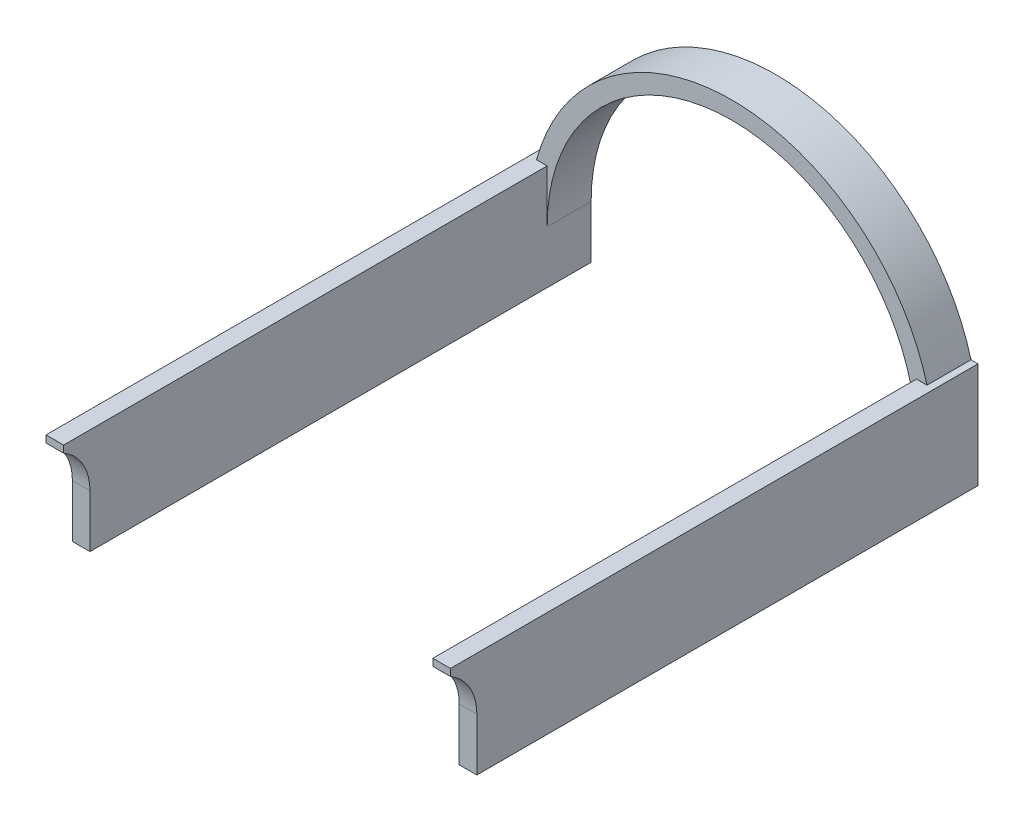
ISO-10303-21;
HEADER;
FILE_DESCRIPTION(('STEP AP214'),'2;1');
FILE_NAME('part.step','',(''),(''),'','','');
FILE_SCHEMA(('AUTOMOTIVE_DESIGN { 1 0 10303 214 1 1 1 1 }'));
ENDSEC;
DATA;
#1=APPLICATION_CONTEXT('core data for automotive mechanical design processes');
#2=APPLICATION_PROTOCOL_DEFINITION('international standard','automotive_design',2000,#1);
#3=PRODUCT_CONTEXT('',#1,'mechanical');
#4=PRODUCT('Part','Part','',(#3));
#5=PRODUCT_RELATED_PRODUCT_CATEGORY('part','',(#4));
#6=PRODUCT_DEFINITION_FORMATION('','',#4);
#7=PRODUCT_DEFINITION_CONTEXT('part definition',#1,'design');
#8=PRODUCT_DEFINITION('design','',#6,#7);
#9=PRODUCT_DEFINITION_SHAPE('','',#8);
#10=(LENGTH_UNIT() NAMED_UNIT(*) SI_UNIT(.MILLI.,.METRE.));
#11=(NAMED_UNIT(*) PLANE_ANGLE_UNIT() SI_UNIT($,.RADIAN.));
#12=(NAMED_UNIT(*) SI_UNIT($,.STERADIAN.) SOLID_ANGLE_UNIT());
#13=UNCERTAINTY_MEASURE_WITH_UNIT(LENGTH_MEASURE(1.E-05),#10,'distance_accuracy_value','');
#14=(GEOMETRIC_REPRESENTATION_CONTEXT(3) GLOBAL_UNCERTAINTY_ASSIGNED_CONTEXT((#13)) GLOBAL_UNIT_ASSIGNED_CONTEXT((#10,
#11,#12)) REPRESENTATION_CONTEXT('',''));
#15=CARTESIAN_POINT('',(0.,0.,0.));
#16=DIRECTION('',(0.,0.,1.));
#17=DIRECTION('',(1.,0.,0.));
#18=AXIS2_PLACEMENT_3D('',#15,#16,#17);
#19=CARTESIAN_POINT('',(0.,0.,10.));
#20=DIRECTION('',(0.,0.,-1.));
#21=DIRECTION('',(-1.,0.,0.));
#22=AXIS2_PLACEMENT_3D('',#19,#20,#21);
#23=CYLINDRICAL_SURFACE('',#22,46.);
#24=CARTESIAN_POINT('',(0.,0.,0.));
#25=DIRECTION('',(0.,0.,1.));
#26=DIRECTION('',(-1.,0.,0.));
#27=AXIS2_PLACEMENT_3D('',#24,#25,#26);
#28=CIRCLE('',#27,46.);
#29=CARTESIAN_POINT('',(44.407206622349,12.,0.));
#30=VERTEX_POINT('',#29);
#31=CARTESIAN_POINT('',(-44.407206622349,12.,0.));
#32=VERTEX_POINT('',#31);
#33=EDGE_CURVE('E296',#30,#32,#28,.T.);
#34=ORIENTED_EDGE('',*,*,#33,.T.);
#35=DIRECTION('',(0.,0.,-1.));
#36=VECTOR('',#35,1.);
#37=CARTESIAN_POINT('',(-44.407206622349,12.,10.));
#38=LINE('',#37,#36);
#39=CARTESIAN_POINT('',(-44.407206622349,12.,10.));
#40=VERTEX_POINT('',#39);
#41=EDGE_CURVE('E237',#32,#40,#38,.F.);
#42=ORIENTED_EDGE('',*,*,#41,.T.);
#43=CARTESIAN_POINT('',(0.,0.,10.));
#44=DIRECTION('',(0.,0.,1.));
#45=DIRECTION('',(-1.,0.,0.));
#46=AXIS2_PLACEMENT_3D('',#43,#44,#45);
#47=CIRCLE('',#46,46.);
#48=CARTESIAN_POINT('',(44.407206622349,12.,10.));
#49=VERTEX_POINT('',#48);
#50=EDGE_CURVE('E297',#49,#40,#47,.T.);
#51=ORIENTED_EDGE('',*,*,#50,.F.);
#52=DIRECTION('',(0.,0.,-1.));
#53=VECTOR('',#52,1.);
#54=CARTESIAN_POINT('',(44.407206622349,12.,10.));
#55=LINE('',#54,#53);
#56=EDGE_CURVE('E292',#49,#30,#55,.T.);
#57=ORIENTED_EDGE('',*,*,#56,.T.);
#58=EDGE_LOOP('',(#34,#42,#51,#57));
#59=FACE_BOUND('',#58,.T.);
#60=ADVANCED_FACE('F39',(#59),#23,.T.);
#61=CARTESIAN_POINT('',(0.,0.,10.));
#62=DIRECTION('',(0.,0.,-1.));
#63=DIRECTION('',(-1.,0.,0.));
#64=AXIS2_PLACEMENT_3D('',#61,#62,#63);
#65=CYLINDRICAL_SURFACE('',#64,42.);
#66=CARTESIAN_POINT('',(0.,0.,0.));
#67=DIRECTION('',(0.,0.,-1.));
#68=DIRECTION('',(-1.,0.,0.));
#69=AXIS2_PLACEMENT_3D('',#66,#67,#68);
#70=CIRCLE('',#69,42.);
#71=CARTESIAN_POINT('',(-42.,0.,0.));
#72=VERTEX_POINT('',#71);
#73=CARTESIAN_POINT('',(42.,0.,0.));
#74=VERTEX_POINT('',#73);
#75=EDGE_CURVE('E302',#72,#74,#70,.T.);
#76=ORIENTED_EDGE('',*,*,#75,.T.);
#77=DIRECTION('',(0.,0.,-1.));
#78=VECTOR('',#77,1.);
#79=CARTESIAN_POINT('',(42.,0.,10.));
#80=LINE('',#79,#78);
#81=CARTESIAN_POINT('',(42.,0.,10.));
#82=VERTEX_POINT('',#81);
#83=EDGE_CURVE('E306',#82,#74,#80,.T.);
#84=ORIENTED_EDGE('',*,*,#83,.F.);
#85=CARTESIAN_POINT('',(0.,0.,10.));
#86=DIRECTION('',(0.,0.,-1.));
#87=DIRECTION('',(-1.,0.,0.));
#88=AXIS2_PLACEMENT_3D('',#85,#86,#87);
#89=CIRCLE('',#88,42.);
#90=CARTESIAN_POINT('',(-42.,0.,10.));
#91=VERTEX_POINT('',#90);
#92=EDGE_CURVE('E301',#91,#82,#89,.T.);
#93=ORIENTED_EDGE('',*,*,#92,.F.);
#94=DIRECTION('',(0.,0.,-1.));
#95=VECTOR('',#94,1.);
#96=CARTESIAN_POINT('',(-42.,0.,10.));
#97=LINE('',#96,#95);
#98=EDGE_CURVE('E315',#91,#72,#97,.T.);
#99=ORIENTED_EDGE('',*,*,#98,.T.);
#100=EDGE_LOOP('',(#76,#84,#93,#99));
#101=FACE_BOUND('',#100,.T.);
#102=ADVANCED_FACE('F354',(#101),#65,.F.);
#103=CARTESIAN_POINT('',(0.,0.,10.));
#104=DIRECTION('',(0.,0.,-1.));
#105=DIRECTION('',(-1.,0.,0.));
#106=AXIS2_PLACEMENT_3D('',#103,#104,#105);
#107=PLANE('',#106);
#108=DIRECTION('',(1.,0.,0.));
#109=VECTOR('',#108,1.);
#110=CARTESIAN_POINT('',(0.,12.,10.));
#111=LINE('',#110,#109);
#112=CARTESIAN_POINT('',(-42.,12.,10.));
#113=VERTEX_POINT('',#112);
#114=EDGE_CURVE('E224',#40,#113,#111,.T.);
#115=ORIENTED_EDGE('',*,*,#114,.T.);
#116=DIRECTION('',(0.,-1.,0.));
#117=VECTOR('',#116,1.);
#118=CARTESIAN_POINT('',(-42.,0.,10.));
#119=LINE('',#118,#117);
#120=EDGE_CURVE('E241',#113,#91,#119,.T.);
#121=ORIENTED_EDGE('',*,*,#120,.T.);
#122=ORIENTED_EDGE('',*,*,#92,.T.);
#123=DIRECTION('',(0.,1.,0.));
#124=VECTOR('',#123,1.);
#125=CARTESIAN_POINT('',(42.,0.,10.));
#126=LINE('',#125,#124);
#127=CARTESIAN_POINT('',(42.,12.,10.));
#128=VERTEX_POINT('',#127);
#129=EDGE_CURVE('E276',#82,#128,#126,.T.);
#130=ORIENTED_EDGE('',*,*,#129,.T.);
#131=DIRECTION('',(1.,0.,0.));
#132=VECTOR('',#131,1.);
#133=CARTESIAN_POINT('',(0.,12.,10.));
#134=LINE('',#133,#132);
#135=EDGE_CURVE('E288',#128,#49,#134,.T.);
#136=ORIENTED_EDGE('',*,*,#135,.T.);
#137=ORIENTED_EDGE('',*,*,#50,.T.);
#138=EDGE_LOOP('',(#115,#121,#122,#130,#136,#137));
#139=FACE_BOUND('',#138,.T.);
#140=ADVANCED_FACE('F351',(#139),#107,.F.);
#141=CARTESIAN_POINT('',(0.,0.,0.));
#142=DIRECTION('',(0.,0.,-1.));
#143=DIRECTION('',(-1.,0.,0.));
#144=AXIS2_PLACEMENT_3D('',#141,#142,#143);
#145=PLANE('',#144);
#146=ORIENTED_EDGE('',*,*,#75,.F.);
#147=DIRECTION('',(0.,-1.,0.));
#148=VECTOR('',#147,1.);
#149=CARTESIAN_POINT('',(-42.,12.,0.));
#150=LINE('',#149,#148);
#151=CARTESIAN_POINT('',(-42.,-12.,0.));
#152=VERTEX_POINT('',#151);
#153=EDGE_CURVE('E215',#72,#152,#150,.T.);
#154=ORIENTED_EDGE('',*,*,#153,.T.);
#155=DIRECTION('',(-1.,0.,0.));
#156=VECTOR('',#155,1.);
#157=CARTESIAN_POINT('',(-46.,-12.,0.));
#158=LINE('',#157,#156);
#159=CARTESIAN_POINT('',(-46.,-12.,0.));
#160=VERTEX_POINT('',#159);
#161=EDGE_CURVE('E200',#152,#160,#158,.T.);
#162=ORIENTED_EDGE('',*,*,#161,.T.);
#163=DIRECTION('',(0.,1.,0.));
#164=VECTOR('',#163,1.);
#165=CARTESIAN_POINT('',(-46.,12.,0.));
#166=LINE('',#165,#164);
#167=CARTESIAN_POINT('',(-46.,12.,0.));
#168=VERTEX_POINT('',#167);
#169=EDGE_CURVE('E195',#160,#168,#166,.T.);
#170=ORIENTED_EDGE('',*,*,#169,.T.);
#171=DIRECTION('',(1.,0.,0.));
#172=VECTOR('',#171,1.);
#173=CARTESIAN_POINT('',(-46.,12.,0.));
#174=LINE('',#173,#172);
#175=EDGE_CURVE('E211',#168,#32,#174,.T.);
#176=ORIENTED_EDGE('',*,*,#175,.T.);
#177=ORIENTED_EDGE('',*,*,#33,.F.);
#178=DIRECTION('',(1.,0.,0.));
#179=VECTOR('',#178,1.);
#180=CARTESIAN_POINT('',(46.,12.,0.));
#181=LINE('',#180,#179);
#182=CARTESIAN_POINT('',(46.,12.,0.));
#183=VERTEX_POINT('',#182);
#184=EDGE_CURVE('E251',#30,#183,#181,.T.);
#185=ORIENTED_EDGE('',*,*,#184,.T.);
#186=DIRECTION('',(0.,-1.,0.));
#187=VECTOR('',#186,1.);
#188=CARTESIAN_POINT('',(46.,12.,0.));
#189=LINE('',#188,#187);
#190=CARTESIAN_POINT('',(46.,-12.,0.));
#191=VERTEX_POINT('',#190);
#192=EDGE_CURVE('E245',#183,#191,#189,.T.);
#193=ORIENTED_EDGE('',*,*,#192,.T.);
#194=DIRECTION('',(-1.,0.,0.));
#195=VECTOR('',#194,1.);
#196=CARTESIAN_POINT('',(46.,-12.,0.));
#197=LINE('',#196,#195);
#198=CARTESIAN_POINT('',(42.,-12.,0.));
#199=VERTEX_POINT('',#198);
#200=EDGE_CURVE('E262',#191,#199,#197,.T.);
#201=ORIENTED_EDGE('',*,*,#200,.T.);
#202=DIRECTION('',(0.,1.,0.));
#203=VECTOR('',#202,1.);
#204=CARTESIAN_POINT('',(42.,12.,0.));
#205=LINE('',#204,#203);
#206=EDGE_CURVE('E266',#199,#74,#205,.T.);
#207=ORIENTED_EDGE('',*,*,#206,.T.);
#208=EDGE_LOOP('',(#146,#154,#162,#170,#176,#177,#185,#193,#201,#207));
#209=FACE_BOUND('',#208,.T.);
#210=ADVANCED_FACE('F357',(#209),#145,.T.);
#211=CARTESIAN_POINT('',(46.,12.,120.));
#212=DIRECTION('',(0.,1.,0.));
#213=DIRECTION('',(0.,0.,1.));
#214=AXIS2_PLACEMENT_3D('',#211,#212,#213);
#215=PLANE('',#214);
#216=ORIENTED_EDGE('',*,*,#56,.F.);
#217=ORIENTED_EDGE('',*,*,#135,.F.);
#218=DIRECTION('',(0.,0.,-1.));
#219=VECTOR('',#218,1.);
#220=CARTESIAN_POINT('',(42.,12.,120.));
#221=LINE('',#220,#219);
#222=CARTESIAN_POINT('',(42.,12.,120.));
#223=VERTEX_POINT('',#222);
#224=EDGE_CURVE('E277',#223,#128,#221,.T.);
#225=ORIENTED_EDGE('',*,*,#224,.F.);
#226=DIRECTION('',(1.,0.,0.));
#227=VECTOR('',#226,1.);
#228=CARTESIAN_POINT('',(46.,12.,120.));
#229=LINE('',#228,#227);
#230=CARTESIAN_POINT('',(46.,12.,120.));
#231=VERTEX_POINT('',#230);
#232=EDGE_CURVE('E254',#223,#231,#229,.T.);
#233=ORIENTED_EDGE('',*,*,#232,.T.);
#234=DIRECTION('',(0.,0.,-1.));
#235=VECTOR('',#234,1.);
#236=CARTESIAN_POINT('',(46.,12.,120.));
#237=LINE('',#236,#235);
#238=EDGE_CURVE('E272',#231,#183,#237,.T.);
#239=ORIENTED_EDGE('',*,*,#238,.T.);
#240=ORIENTED_EDGE('',*,*,#184,.F.);
#241=EDGE_LOOP('',(#216,#217,#225,#233,#239,#240));
#242=FACE_BOUND('',#241,.T.);
#243=ADVANCED_FACE('F346',(#242),#215,.T.);
#244=CARTESIAN_POINT('',(42.,12.,120.));
#245=DIRECTION('',(-1.,0.,0.));
#246=DIRECTION('',(0.,0.,1.));
#247=AXIS2_PLACEMENT_3D('',#244,#245,#246);
#248=PLANE('',#247);
#249=CARTESIAN_POINT('',(42.,0.,126.));
#250=DIRECTION('',(-1.,0.,0.));
#251=DIRECTION('',(0.,0.,1.));
#252=AXIS2_PLACEMENT_3D('',#249,#250,#251);
#253=CIRCLE('',#252,12.);
#254=CARTESIAN_POINT('',(42.,10.3923048454133,120.));
#255=VERTEX_POINT('',#254);
#256=CARTESIAN_POINT('',(42.,0.,114.));
#257=VERTEX_POINT('',#256);
#258=EDGE_CURVE('E186',#255,#257,#253,.T.);
#259=ORIENTED_EDGE('',*,*,#258,.F.);
#260=DIRECTION('',(0.,1.,0.));
#261=VECTOR('',#260,1.);
#262=CARTESIAN_POINT('',(42.,12.,120.));
#263=LINE('',#262,#261);
#264=EDGE_CURVE('E250',#255,#223,#263,.T.);
#265=ORIENTED_EDGE('',*,*,#264,.T.);
#266=ORIENTED_EDGE('',*,*,#224,.T.);
#267=ORIENTED_EDGE('',*,*,#129,.F.);
#268=ORIENTED_EDGE('',*,*,#83,.T.);
#269=ORIENTED_EDGE('',*,*,#206,.F.);
#270=DIRECTION('',(0.,0.,-1.));
#271=VECTOR('',#270,1.);
#272=CARTESIAN_POINT('',(42.,-12.,120.));
#273=LINE('',#272,#271);
#274=CARTESIAN_POINT('',(42.,-12.,114.));
#275=VERTEX_POINT('',#274);
#276=EDGE_CURVE('E280',#275,#199,#273,.T.);
#277=ORIENTED_EDGE('',*,*,#276,.F.);
#278=DIRECTION('',(0.,-1.,0.));
#279=VECTOR('',#278,1.);
#280=CARTESIAN_POINT('',(42.,12.,114.));
#281=LINE('',#280,#279);
#282=EDGE_CURVE('E192',#257,#275,#281,.T.);
#283=ORIENTED_EDGE('',*,*,#282,.F.);
#284=EDGE_LOOP('',(#259,#265,#266,#267,#268,#269,#277,#283));
#285=FACE_BOUND('',#284,.T.);
#286=ADVANCED_FACE('F330',(#285),#248,.T.);
#287=CARTESIAN_POINT('',(46.,12.,120.));
#288=DIRECTION('',(1.,0.,0.));
#289=DIRECTION('',(0.,1.,0.));
#290=AXIS2_PLACEMENT_3D('',#287,#288,#289);
#291=PLANE('',#290);
#292=CARTESIAN_POINT('',(46.,0.,126.));
#293=DIRECTION('',(1.,0.,0.));
#294=DIRECTION('',(0.,1.,0.));
#295=AXIS2_PLACEMENT_3D('',#292,#293,#294);
#296=CIRCLE('',#295,12.);
#297=CARTESIAN_POINT('',(46.,0.,114.));
#298=VERTEX_POINT('',#297);
#299=CARTESIAN_POINT('',(46.,10.3923048454133,120.));
#300=VERTEX_POINT('',#299);
#301=EDGE_CURVE('E54',#298,#300,#296,.T.);
#302=ORIENTED_EDGE('',*,*,#301,.F.);
#303=DIRECTION('',(0.,1.,0.));
#304=VECTOR('',#303,1.);
#305=CARTESIAN_POINT('',(46.,12.,114.));
#306=LINE('',#305,#304);
#307=CARTESIAN_POINT('',(46.,-12.,114.));
#308=VERTEX_POINT('',#307);
#309=EDGE_CURVE('E189',#308,#298,#306,.T.);
#310=ORIENTED_EDGE('',*,*,#309,.F.);
#311=DIRECTION('',(0.,0.,-1.));
#312=VECTOR('',#311,1.);
#313=CARTESIAN_POINT('',(46.,-12.,120.));
#314=LINE('',#313,#312);
#315=EDGE_CURVE('E258',#308,#191,#314,.T.);
#316=ORIENTED_EDGE('',*,*,#315,.T.);
#317=ORIENTED_EDGE('',*,*,#192,.F.);
#318=ORIENTED_EDGE('',*,*,#238,.F.);
#319=DIRECTION('',(0.,-1.,0.));
#320=VECTOR('',#319,1.);
#321=CARTESIAN_POINT('',(46.,12.,120.));
#322=LINE('',#321,#320);
#323=EDGE_CURVE('E246',#231,#300,#322,.T.);
#324=ORIENTED_EDGE('',*,*,#323,.T.);
#325=EDGE_LOOP('',(#302,#310,#316,#317,#318,#324));
#326=FACE_BOUND('',#325,.T.);
#327=ADVANCED_FACE('F338',(#326),#291,.T.);
#328=CARTESIAN_POINT('',(46.,-12.,120.));
#329=DIRECTION('',(0.,-1.,0.));
#330=DIRECTION('',(0.,0.,-1.));
#331=AXIS2_PLACEMENT_3D('',#328,#329,#330);
#332=PLANE('',#331);
#333=DIRECTION('',(-1.,0.,0.));
#334=VECTOR('',#333,1.);
#335=CARTESIAN_POINT('',(74.,-12.,114.));
#336=LINE('',#335,#334);
#337=EDGE_CURVE('E177',#308,#275,#336,.T.);
#338=ORIENTED_EDGE('',*,*,#337,.T.);
#339=ORIENTED_EDGE('',*,*,#276,.T.);
#340=ORIENTED_EDGE('',*,*,#200,.F.);
#341=ORIENTED_EDGE('',*,*,#315,.F.);
#342=EDGE_LOOP('',(#338,#339,#340,#341));
#343=FACE_BOUND('',#342,.T.);
#344=ADVANCED_FACE('F335',(#343),#332,.T.);
#345=CARTESIAN_POINT('',(0.,0.,120.));
#346=DIRECTION('',(0.,0.,-1.));
#347=DIRECTION('',(-1.,0.,0.));
#348=AXIS2_PLACEMENT_3D('',#345,#346,#347);
#349=PLANE('',#348);
#350=ORIENTED_EDGE('',*,*,#264,.F.);
#351=DIRECTION('',(-1.,0.,0.));
#352=VECTOR('',#351,1.);
#353=CARTESIAN_POINT('',(74.,10.3923048454133,120.));
#354=LINE('',#353,#352);
#355=EDGE_CURVE('E181',#255,#300,#354,.F.);
#356=ORIENTED_EDGE('',*,*,#355,.T.);
#357=ORIENTED_EDGE('',*,*,#323,.F.);
#358=ORIENTED_EDGE('',*,*,#232,.F.);
#359=EDGE_LOOP('',(#350,#356,#357,#358));
#360=FACE_BOUND('',#359,.T.);
#361=ADVANCED_FACE('F343',(#360),#349,.F.);
#362=CARTESIAN_POINT('',(-46.,12.,120.));
#363=DIRECTION('',(0.,1.,0.));
#364=DIRECTION('',(0.,0.,1.));
#365=AXIS2_PLACEMENT_3D('',#362,#363,#364);
#366=PLANE('',#365);
#367=ORIENTED_EDGE('',*,*,#41,.F.);
#368=ORIENTED_EDGE('',*,*,#175,.F.);
#369=DIRECTION('',(0.,0.,-1.));
#370=VECTOR('',#369,1.);
#371=CARTESIAN_POINT('',(-46.,12.,120.));
#372=LINE('',#371,#370);
#373=CARTESIAN_POINT('',(-46.,12.,120.));
#374=VERTEX_POINT('',#373);
#375=EDGE_CURVE('E208',#374,#168,#372,.T.);
#376=ORIENTED_EDGE('',*,*,#375,.F.);
#377=DIRECTION('',(1.,0.,0.));
#378=VECTOR('',#377,1.);
#379=CARTESIAN_POINT('',(-46.,12.,120.));
#380=LINE('',#379,#378);
#381=CARTESIAN_POINT('',(-42.,12.,120.));
#382=VERTEX_POINT('',#381);
#383=EDGE_CURVE('E199',#374,#382,#380,.T.);
#384=ORIENTED_EDGE('',*,*,#383,.T.);
#385=DIRECTION('',(0.,0.,-1.));
#386=VECTOR('',#385,1.);
#387=CARTESIAN_POINT('',(-42.,12.,120.));
#388=LINE('',#387,#386);
#389=EDGE_CURVE('E228',#382,#113,#388,.T.);
#390=ORIENTED_EDGE('',*,*,#389,.T.);
#391=ORIENTED_EDGE('',*,*,#114,.F.);
#392=EDGE_LOOP('',(#367,#368,#376,#384,#390,#391));
#393=FACE_BOUND('',#392,.T.);
#394=ADVANCED_FACE('F363',(#393),#366,.T.);
#395=CARTESIAN_POINT('',(-46.,12.,120.));
#396=DIRECTION('',(-1.,0.,0.));
#397=DIRECTION('',(0.,0.,1.));
#398=AXIS2_PLACEMENT_3D('',#395,#396,#397);
#399=PLANE('',#398);
#400=CARTESIAN_POINT('',(-46.,0.,126.));
#401=DIRECTION('',(-1.,0.,0.));
#402=DIRECTION('',(0.,0.,1.));
#403=AXIS2_PLACEMENT_3D('',#400,#401,#402);
#404=CIRCLE('',#403,12.);
#405=CARTESIAN_POINT('',(-46.,10.3923048454133,120.));
#406=VERTEX_POINT('',#405);
#407=CARTESIAN_POINT('',(-46.,0.,114.));
#408=VERTEX_POINT('',#407);
#409=EDGE_CURVE('E162',#406,#408,#404,.T.);
#410=ORIENTED_EDGE('',*,*,#409,.F.);
#411=DIRECTION('',(0.,1.,0.));
#412=VECTOR('',#411,1.);
#413=CARTESIAN_POINT('',(-46.,12.,120.));
#414=LINE('',#413,#412);
#415=EDGE_CURVE('E196',#406,#374,#414,.T.);
#416=ORIENTED_EDGE('',*,*,#415,.T.);
#417=ORIENTED_EDGE('',*,*,#375,.T.);
#418=ORIENTED_EDGE('',*,*,#169,.F.);
#419=DIRECTION('',(0.,0.,-1.));
#420=VECTOR('',#419,1.);
#421=CARTESIAN_POINT('',(-46.,-12.,120.));
#422=LINE('',#421,#420);
#423=CARTESIAN_POINT('',(-46.,-12.,114.));
#424=VERTEX_POINT('',#423);
#425=EDGE_CURVE('E171',#424,#160,#422,.T.);
#426=ORIENTED_EDGE('',*,*,#425,.F.);
#427=DIRECTION('',(0.,-1.,0.));
#428=VECTOR('',#427,1.);
#429=CARTESIAN_POINT('',(-46.,0.,114.));
#430=LINE('',#429,#428);
#431=EDGE_CURVE('E155',#408,#424,#430,.T.);
#432=ORIENTED_EDGE('',*,*,#431,.F.);
#433=EDGE_LOOP('',(#410,#416,#417,#418,#426,#432));
#434=FACE_BOUND('',#433,.T.);
#435=ADVANCED_FACE('F169',(#434),#399,.T.);
#436=CARTESIAN_POINT('',(-46.,-12.,120.));
#437=DIRECTION('',(0.,-1.,0.));
#438=DIRECTION('',(0.,0.,-1.));
#439=AXIS2_PLACEMENT_3D('',#436,#437,#438);
#440=PLANE('',#439);
#441=CARTESIAN_POINT('',(-42.,-12.,114.));
#442=VERTEX_POINT('',#441);
#443=EDGE_CURVE('E175',#442,#424,#336,.T.);
#444=ORIENTED_EDGE('',*,*,#443,.T.);
#445=ORIENTED_EDGE('',*,*,#425,.T.);
#446=ORIENTED_EDGE('',*,*,#161,.F.);
#447=DIRECTION('',(0.,0.,-1.));
#448=VECTOR('',#447,1.);
#449=CARTESIAN_POINT('',(-42.,-12.,120.));
#450=LINE('',#449,#448);
#451=EDGE_CURVE('E225',#442,#152,#450,.T.);
#452=ORIENTED_EDGE('',*,*,#451,.F.);
#453=EDGE_LOOP('',(#444,#445,#446,#452));
#454=FACE_BOUND('',#453,.T.);
#455=ADVANCED_FACE('F372',(#454),#440,.T.);
#456=CARTESIAN_POINT('',(-42.,12.,120.));
#457=DIRECTION('',(1.,0.,0.));
#458=DIRECTION('',(0.,1.,0.));
#459=AXIS2_PLACEMENT_3D('',#456,#457,#458);
#460=PLANE('',#459);
#461=CARTESIAN_POINT('',(-42.,0.,126.));
#462=DIRECTION('',(1.,0.,0.));
#463=DIRECTION('',(0.,1.,0.));
#464=AXIS2_PLACEMENT_3D('',#461,#462,#463);
#465=CIRCLE('',#464,12.);
#466=CARTESIAN_POINT('',(-42.,0.,114.));
#467=VERTEX_POINT('',#466);
#468=CARTESIAN_POINT('',(-42.,10.3923048454133,120.));
#469=VERTEX_POINT('',#468);
#470=EDGE_CURVE('E62',#467,#469,#465,.T.);
#471=ORIENTED_EDGE('',*,*,#470,.F.);
#472=DIRECTION('',(0.,1.,0.));
#473=VECTOR('',#472,1.);
#474=CARTESIAN_POINT('',(-42.,12.,114.));
#475=LINE('',#474,#473);
#476=EDGE_CURVE('E11',#442,#467,#475,.T.);
#477=ORIENTED_EDGE('',*,*,#476,.F.);
#478=ORIENTED_EDGE('',*,*,#451,.T.);
#479=ORIENTED_EDGE('',*,*,#153,.F.);
#480=ORIENTED_EDGE('',*,*,#98,.F.);
#481=ORIENTED_EDGE('',*,*,#120,.F.);
#482=ORIENTED_EDGE('',*,*,#389,.F.);
#483=DIRECTION('',(0.,-1.,0.));
#484=VECTOR('',#483,1.);
#485=CARTESIAN_POINT('',(-42.,12.,120.));
#486=LINE('',#485,#484);
#487=EDGE_CURVE('E204',#382,#469,#486,.T.);
#488=ORIENTED_EDGE('',*,*,#487,.T.);
#489=EDGE_LOOP('',(#471,#477,#478,#479,#480,#481,#482,#488));
#490=FACE_BOUND('',#489,.T.);
#491=ADVANCED_FACE('F369',(#490),#460,.T.);
#492=CARTESIAN_POINT('',(0.,0.,120.));
#493=DIRECTION('',(0.,0.,1.));
#494=DIRECTION('',(1.,0.,0.));
#495=AXIS2_PLACEMENT_3D('',#492,#493,#494);
#496=PLANE('',#495);
#497=DIRECTION('',(-1.,0.,0.));
#498=VECTOR('',#497,1.);
#499=CARTESIAN_POINT('',(74.,10.3923048454133,120.));
#500=LINE('',#499,#498);
#501=EDGE_CURVE('E47',#469,#406,#500,.T.);
#502=ORIENTED_EDGE('',*,*,#501,.F.);
#503=ORIENTED_EDGE('',*,*,#487,.F.);
#504=ORIENTED_EDGE('',*,*,#383,.F.);
#505=ORIENTED_EDGE('',*,*,#415,.F.);
#506=EDGE_LOOP('',(#502,#503,#504,#505));
#507=FACE_BOUND('',#506,.T.);
#508=ADVANCED_FACE('F374',(#507),#496,.T.);
#509=CARTESIAN_POINT('',(74.,0.,126.));
#510=DIRECTION('',(-1.,0.,0.));
#511=DIRECTION('',(0.,0.,1.));
#512=AXIS2_PLACEMENT_3D('',#509,#510,#511);
#513=CYLINDRICAL_SURFACE('',#512,12.);
#514=ORIENTED_EDGE('',*,*,#470,.T.);
#515=ORIENTED_EDGE('',*,*,#501,.T.);
#516=ORIENTED_EDGE('',*,*,#409,.T.);
#517=DIRECTION('',(-1.,0.,0.));
#518=VECTOR('',#517,1.);
#519=CARTESIAN_POINT('',(74.,0.,114.));
#520=LINE('',#519,#518);
#521=EDGE_CURVE('E151',#467,#408,#520,.T.);
#522=ORIENTED_EDGE('',*,*,#521,.F.);
#523=EDGE_LOOP('',(#514,#515,#516,#522));
#524=FACE_BOUND('',#523,.T.);
#525=ADVANCED_FACE('F163',(#524),#513,.F.);
#526=CARTESIAN_POINT('',(74.,0.,114.));
#527=DIRECTION('',(0.,0.,-1.));
#528=DIRECTION('',(-1.,0.,0.));
#529=AXIS2_PLACEMENT_3D('',#526,#527,#528);
#530=PLANE('',#529);
#531=ORIENTED_EDGE('',*,*,#476,.T.);
#532=ORIENTED_EDGE('',*,*,#521,.T.);
#533=ORIENTED_EDGE('',*,*,#431,.T.);
#534=ORIENTED_EDGE('',*,*,#443,.F.);
#535=EDGE_LOOP('',(#531,#532,#533,#534));
#536=FACE_BOUND('',#535,.T.);
#537=ADVANCED_FACE('F153',(#536),#530,.F.);
#538=ORIENTED_EDGE('',*,*,#282,.T.);
#539=ORIENTED_EDGE('',*,*,#337,.F.);
#540=ORIENTED_EDGE('',*,*,#309,.T.);
#541=EDGE_CURVE('E159',#298,#257,#520,.T.);
#542=ORIENTED_EDGE('',*,*,#541,.T.);
#543=EDGE_LOOP('',(#538,#539,#540,#542));
#544=FACE_BOUND('',#543,.T.);
#545=ADVANCED_FACE('F325',(#544),#530,.F.);
#546=ORIENTED_EDGE('',*,*,#258,.T.);
#547=ORIENTED_EDGE('',*,*,#541,.F.);
#548=ORIENTED_EDGE('',*,*,#301,.T.);
#549=ORIENTED_EDGE('',*,*,#355,.F.);
#550=EDGE_LOOP('',(#546,#547,#548,#549));
#551=FACE_BOUND('',#550,.T.);
#552=ADVANCED_FACE('F382',(#551),#513,.F.);
#553=CLOSED_SHELL('',(#60,#102,#140,#210,#243,#286,#327,#344,#361,#394,#435,#455,#491,#508,#525,
#537,#545,#552));
#554=MANIFOLD_SOLID_BREP('B2',#553);
#555=ADVANCED_BREP_SHAPE_REPRESENTATION('',(#18,#554),#14);
#556=SHAPE_DEFINITION_REPRESENTATION(#9,#555);
ENDSEC;
END-ISO-10303-21;
